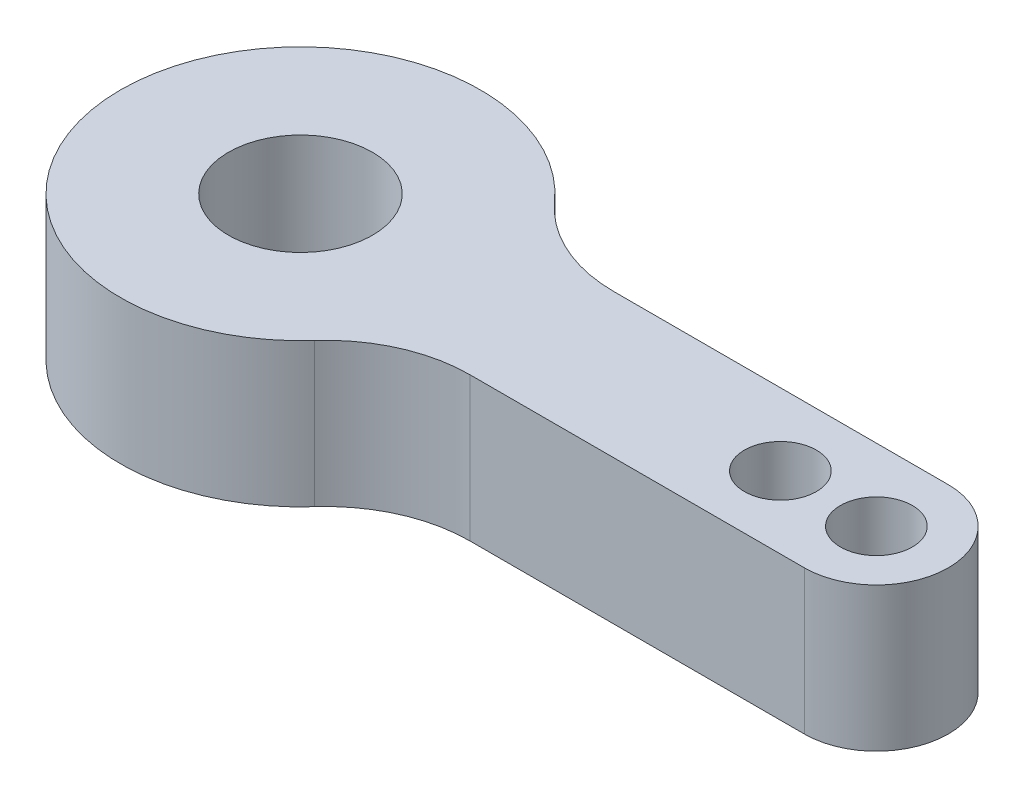
ISO-10303-21;
HEADER;
FILE_DESCRIPTION(('STEP AP214'),'2;1');
FILE_NAME('part.step','',(''),(''),'','','');
FILE_SCHEMA(('AUTOMOTIVE_DESIGN { 1 0 10303 214 1 1 1 1 }'));
ENDSEC;
DATA;
#1=APPLICATION_CONTEXT('core data for automotive mechanical design processes');
#2=APPLICATION_PROTOCOL_DEFINITION('international standard','automotive_design',2000,#1);
#3=PRODUCT_CONTEXT('',#1,'mechanical');
#4=PRODUCT('Part','Part','',(#3));
#5=PRODUCT_RELATED_PRODUCT_CATEGORY('part','',(#4));
#6=PRODUCT_DEFINITION_FORMATION('','',#4);
#7=PRODUCT_DEFINITION_CONTEXT('part definition',#1,'design');
#8=PRODUCT_DEFINITION('design','',#6,#7);
#9=PRODUCT_DEFINITION_SHAPE('','',#8);
#10=(LENGTH_UNIT() NAMED_UNIT(*) SI_UNIT(.MILLI.,.METRE.));
#11=(NAMED_UNIT(*) PLANE_ANGLE_UNIT() SI_UNIT($,.RADIAN.));
#12=(NAMED_UNIT(*) SI_UNIT($,.STERADIAN.) SOLID_ANGLE_UNIT());
#13=UNCERTAINTY_MEASURE_WITH_UNIT(LENGTH_MEASURE(1.E-05),#10,'distance_accuracy_value','');
#14=(GEOMETRIC_REPRESENTATION_CONTEXT(3) GLOBAL_UNCERTAINTY_ASSIGNED_CONTEXT((#13)) GLOBAL_UNIT_ASSIGNED_CONTEXT((#10,
#11,#12)) REPRESENTATION_CONTEXT('',''));
#15=CARTESIAN_POINT('',(0.,0.,0.));
#16=DIRECTION('',(0.,0.,1.));
#17=DIRECTION('',(1.,0.,0.));
#18=AXIS2_PLACEMENT_3D('',#15,#16,#17);
#19=CARTESIAN_POINT('',(0.,0.,0.));
#20=DIRECTION('',(0.,1.,0.));
#21=DIRECTION('',(0.,0.,1.));
#22=AXIS2_PLACEMENT_3D('',#19,#20,#21);
#23=PLANE('',#22);
#24=CARTESIAN_POINT('',(24.,0.,0.));
#25=DIRECTION('',(0.,-1.,0.));
#26=DIRECTION('',(0.,0.,-1.));
#27=AXIS2_PLACEMENT_3D('',#24,#25,#26);
#28=CIRCLE('',#27,1.5);
#29=CARTESIAN_POINT('',(24.,0.,-1.5));
#30=VERTEX_POINT('',#29);
#31=EDGE_CURVE('E108',#30,#30,#28,.F.);
#32=ORIENTED_EDGE('',*,*,#31,.T.);
#33=EDGE_LOOP('',(#32));
#34=FACE_BOUND('',#33,.T.);
#35=CARTESIAN_POINT('',(0.,0.,0.));
#36=DIRECTION('',(0.,-1.,0.));
#37=DIRECTION('',(0.,0.,-1.));
#38=AXIS2_PLACEMENT_3D('',#35,#36,#37);
#39=CIRCLE('',#38,3.);
#40=CARTESIAN_POINT('',(0.,0.,-3.));
#41=VERTEX_POINT('',#40);
#42=EDGE_CURVE('E111',#41,#41,#39,.F.);
#43=ORIENTED_EDGE('',*,*,#42,.T.);
#44=EDGE_LOOP('',(#43));
#45=FACE_BOUND('',#44,.T.);
#46=CARTESIAN_POINT('',(20.,0.,0.));
#47=DIRECTION('',(0.,-1.,0.));
#48=DIRECTION('',(0.,0.,-1.));
#49=AXIS2_PLACEMENT_3D('',#46,#47,#48);
#50=CIRCLE('',#49,1.5);
#51=CARTESIAN_POINT('',(20.,0.,-1.5));
#52=VERTEX_POINT('',#51);
#53=EDGE_CURVE('E114',#52,#52,#50,.F.);
#54=ORIENTED_EDGE('',*,*,#53,.T.);
#55=EDGE_LOOP('',(#54));
#56=FACE_BOUND('',#55,.T.);
#57=CARTESIAN_POINT('',(10.0623058987491,0.,9.00000000000001));
#58=DIRECTION('',(0.,-1.,0.));
#59=DIRECTION('',(0.,0.,-1.));
#60=AXIS2_PLACEMENT_3D('',#57,#58,#59);
#61=CIRCLE('',#60,6.);
#62=CARTESIAN_POINT('',(10.062305898749,0.,3.00000000000001));
#63=VERTEX_POINT('',#62);
#64=CARTESIAN_POINT('',(5.59016994374947,0.,5.00000000000001));
#65=VERTEX_POINT('',#64);
#66=EDGE_CURVE('E118',#63,#65,#61,.F.);
#67=ORIENTED_EDGE('',*,*,#66,.T.);
#68=CARTESIAN_POINT('',(0.,0.,0.));
#69=DIRECTION('',(0.,-1.,0.));
#70=DIRECTION('',(0.,0.,-1.));
#71=AXIS2_PLACEMENT_3D('',#68,#69,#70);
#72=CIRCLE('',#71,7.5);
#73=CARTESIAN_POINT('',(5.59016994374947,0.,-5.));
#74=VERTEX_POINT('',#73);
#75=EDGE_CURVE('E121',#74,#65,#72,.F.);
#76=ORIENTED_EDGE('',*,*,#75,.F.);
#77=CARTESIAN_POINT('',(10.0623058987491,0.,-9.));
#78=DIRECTION('',(0.,-1.,0.));
#79=DIRECTION('',(0.,0.,-1.));
#80=AXIS2_PLACEMENT_3D('',#77,#78,#79);
#81=CIRCLE('',#80,6.);
#82=CARTESIAN_POINT('',(10.0623058987491,0.,-3.));
#83=VERTEX_POINT('',#82);
#84=EDGE_CURVE('E80',#74,#83,#81,.F.);
#85=ORIENTED_EDGE('',*,*,#84,.T.);
#86=DIRECTION('',(1.,0.,0.));
#87=VECTOR('',#86,1.);
#88=CARTESIAN_POINT('',(0.,0.,-3.));
#89=LINE('',#88,#87);
#90=CARTESIAN_POINT('',(24.,0.,-3.));
#91=VERTEX_POINT('',#90);
#92=EDGE_CURVE('E78',#83,#91,#89,.T.);
#93=ORIENTED_EDGE('',*,*,#92,.T.);
#94=CARTESIAN_POINT('',(24.,0.,0.));
#95=DIRECTION('',(0.,-1.,0.));
#96=DIRECTION('',(0.,0.,-1.));
#97=AXIS2_PLACEMENT_3D('',#94,#95,#96);
#98=CIRCLE('',#97,3.);
#99=CARTESIAN_POINT('',(24.,0.,3.));
#100=VERTEX_POINT('',#99);
#101=EDGE_CURVE('E20',#100,#91,#98,.F.);
#102=ORIENTED_EDGE('',*,*,#101,.F.);
#103=DIRECTION('',(1.,0.,0.));
#104=VECTOR('',#103,1.);
#105=CARTESIAN_POINT('',(0.,0.,3.00000000000001));
#106=LINE('',#105,#104);
#107=EDGE_CURVE('E76',#63,#100,#106,.T.);
#108=ORIENTED_EDGE('',*,*,#107,.F.);
#109=EDGE_LOOP('',(#67,#76,#85,#93,#102,#108));
#110=FACE_BOUND('',#109,.T.);
#111=ADVANCED_FACE('F17',(#34,#45,#56,#110),#23,.F.);
#112=CARTESIAN_POINT('',(0.,6.,3.00000000000001));
#113=DIRECTION('',(0.,0.,1.));
#114=DIRECTION('',(1.,0.,0.));
#115=AXIS2_PLACEMENT_3D('',#112,#113,#114);
#116=PLANE('',#115);
#117=ORIENTED_EDGE('',*,*,#107,.T.);
#118=DIRECTION('',(0.,-1.,0.));
#119=VECTOR('',#118,1.);
#120=CARTESIAN_POINT('',(24.,6.,3.));
#121=LINE('',#120,#119);
#122=CARTESIAN_POINT('',(24.,6.,3.));
#123=VERTEX_POINT('',#122);
#124=EDGE_CURVE('E75',#123,#100,#121,.T.);
#125=ORIENTED_EDGE('',*,*,#124,.F.);
#126=DIRECTION('',(1.,0.,0.));
#127=VECTOR('',#126,1.);
#128=CARTESIAN_POINT('',(0.,6.,3.00000000000001));
#129=LINE('',#128,#127);
#130=CARTESIAN_POINT('',(10.0623058987491,6.,3.00000000000001));
#131=VERTEX_POINT('',#130);
#132=EDGE_CURVE('E107',#131,#123,#129,.T.);
#133=ORIENTED_EDGE('',*,*,#132,.F.);
#134=DIRECTION('',(0.,-1.,0.));
#135=VECTOR('',#134,1.);
#136=CARTESIAN_POINT('',(10.0623058987491,6.,3.00000000000001));
#137=LINE('',#136,#135);
#138=EDGE_CURVE('E120',#131,#63,#137,.T.);
#139=ORIENTED_EDGE('',*,*,#138,.T.);
#140=EDGE_LOOP('',(#117,#125,#133,#139));
#141=FACE_BOUND('',#140,.T.);
#142=ADVANCED_FACE('F138',(#141),#116,.T.);
#143=CARTESIAN_POINT('',(24.,6.,0.));
#144=DIRECTION('',(0.,-1.,0.));
#145=DIRECTION('',(0.,0.,-1.));
#146=AXIS2_PLACEMENT_3D('',#143,#144,#145);
#147=CYLINDRICAL_SURFACE('',#146,3.);
#148=CARTESIAN_POINT('',(24.,6.,0.));
#149=DIRECTION('',(0.,-1.,0.));
#150=DIRECTION('',(0.,0.,-1.));
#151=AXIS2_PLACEMENT_3D('',#148,#149,#150);
#152=CIRCLE('',#151,3.);
#153=CARTESIAN_POINT('',(24.,6.,-3.));
#154=VERTEX_POINT('',#153);
#155=EDGE_CURVE('E105',#123,#154,#152,.F.);
#156=ORIENTED_EDGE('',*,*,#155,.F.);
#157=ORIENTED_EDGE('',*,*,#124,.T.);
#158=ORIENTED_EDGE('',*,*,#101,.T.);
#159=DIRECTION('',(0.,1.,0.));
#160=VECTOR('',#159,1.);
#161=CARTESIAN_POINT('',(24.,6.,-3.));
#162=LINE('',#161,#160);
#163=EDGE_CURVE('E73',#91,#154,#162,.T.);
#164=ORIENTED_EDGE('',*,*,#163,.T.);
#165=EDGE_LOOP('',(#156,#157,#158,#164));
#166=FACE_BOUND('',#165,.T.);
#167=ADVANCED_FACE('F71',(#166),#147,.T.);
#168=CARTESIAN_POINT('',(0.,6.,-3.));
#169=DIRECTION('',(0.,0.,1.));
#170=DIRECTION('',(1.,0.,0.));
#171=AXIS2_PLACEMENT_3D('',#168,#169,#170);
#172=PLANE('',#171);
#173=DIRECTION('',(0.,-1.,0.));
#174=VECTOR('',#173,1.);
#175=CARTESIAN_POINT('',(10.0623058987491,6.,-3.));
#176=LINE('',#175,#174);
#177=CARTESIAN_POINT('',(10.0623058987491,6.,-3.));
#178=VERTEX_POINT('',#177);
#179=EDGE_CURVE('E91',#83,#178,#176,.F.);
#180=ORIENTED_EDGE('',*,*,#179,.T.);
#181=DIRECTION('',(1.,0.,0.));
#182=VECTOR('',#181,1.);
#183=CARTESIAN_POINT('',(0.,6.,-3.));
#184=LINE('',#183,#182);
#185=EDGE_CURVE('E86',#154,#178,#184,.F.);
#186=ORIENTED_EDGE('',*,*,#185,.F.);
#187=ORIENTED_EDGE('',*,*,#163,.F.);
#188=ORIENTED_EDGE('',*,*,#92,.F.);
#189=EDGE_LOOP('',(#180,#186,#187,#188));
#190=FACE_BOUND('',#189,.T.);
#191=ADVANCED_FACE('F84',(#190),#172,.F.);
#192=CARTESIAN_POINT('',(10.0623058987491,6.,-9.));
#193=DIRECTION('',(0.,-1.,0.));
#194=DIRECTION('',(0.,0.,-1.));
#195=AXIS2_PLACEMENT_3D('',#192,#193,#194);
#196=CYLINDRICAL_SURFACE('',#195,6.);
#197=ORIENTED_EDGE('',*,*,#179,.F.);
#198=ORIENTED_EDGE('',*,*,#84,.F.);
#199=DIRECTION('',(0.,-1.,0.));
#200=VECTOR('',#199,1.);
#201=CARTESIAN_POINT('',(5.59016994374947,6.,-5.));
#202=LINE('',#201,#200);
#203=CARTESIAN_POINT('',(5.59016994374947,6.,-5.));
#204=VERTEX_POINT('',#203);
#205=EDGE_CURVE('E123',#204,#74,#202,.T.);
#206=ORIENTED_EDGE('',*,*,#205,.F.);
#207=CARTESIAN_POINT('',(10.0623058987491,6.,-9.));
#208=DIRECTION('',(0.,-1.,0.));
#209=DIRECTION('',(0.,0.,-1.));
#210=AXIS2_PLACEMENT_3D('',#207,#208,#209);
#211=CIRCLE('',#210,6.);
#212=EDGE_CURVE('E103',#178,#204,#211,.T.);
#213=ORIENTED_EDGE('',*,*,#212,.F.);
#214=EDGE_LOOP('',(#197,#198,#206,#213));
#215=FACE_BOUND('',#214,.T.);
#216=ADVANCED_FACE('F145',(#215),#196,.F.);
#217=CARTESIAN_POINT('',(0.,6.,0.));
#218=DIRECTION('',(0.,-1.,0.));
#219=DIRECTION('',(0.,0.,-1.));
#220=AXIS2_PLACEMENT_3D('',#217,#218,#219);
#221=CYLINDRICAL_SURFACE('',#220,7.5);
#222=ORIENTED_EDGE('',*,*,#75,.T.);
#223=DIRECTION('',(0.,-1.,0.));
#224=VECTOR('',#223,1.);
#225=CARTESIAN_POINT('',(5.59016994374947,6.,5.00000000000001));
#226=LINE('',#225,#224);
#227=CARTESIAN_POINT('',(5.59016994374947,6.,5.00000000000001));
#228=VERTEX_POINT('',#227);
#229=EDGE_CURVE('E117',#65,#228,#226,.F.);
#230=ORIENTED_EDGE('',*,*,#229,.T.);
#231=CARTESIAN_POINT('',(0.,6.,0.));
#232=DIRECTION('',(0.,-1.,0.));
#233=DIRECTION('',(0.,0.,-1.));
#234=AXIS2_PLACEMENT_3D('',#231,#232,#233);
#235=CIRCLE('',#234,7.5);
#236=EDGE_CURVE('E35',#204,#228,#235,.F.);
#237=ORIENTED_EDGE('',*,*,#236,.F.);
#238=ORIENTED_EDGE('',*,*,#205,.T.);
#239=EDGE_LOOP('',(#222,#230,#237,#238));
#240=FACE_BOUND('',#239,.T.);
#241=ADVANCED_FACE('F143',(#240),#221,.T.);
#242=CARTESIAN_POINT('',(10.0623058987491,6.,9.00000000000001));
#243=DIRECTION('',(0.,-1.,0.));
#244=DIRECTION('',(0.,0.,-1.));
#245=AXIS2_PLACEMENT_3D('',#242,#243,#244);
#246=CYLINDRICAL_SURFACE('',#245,6.);
#247=ORIENTED_EDGE('',*,*,#229,.F.);
#248=ORIENTED_EDGE('',*,*,#66,.F.);
#249=ORIENTED_EDGE('',*,*,#138,.F.);
#250=CARTESIAN_POINT('',(10.0623058987491,6.,9.00000000000001));
#251=DIRECTION('',(0.,-1.,0.));
#252=DIRECTION('',(0.,0.,-1.));
#253=AXIS2_PLACEMENT_3D('',#250,#251,#252);
#254=CIRCLE('',#253,6.);
#255=EDGE_CURVE('E100',#228,#131,#254,.T.);
#256=ORIENTED_EDGE('',*,*,#255,.F.);
#257=EDGE_LOOP('',(#247,#248,#249,#256));
#258=FACE_BOUND('',#257,.T.);
#259=ADVANCED_FACE('F142',(#258),#246,.F.);
#260=CARTESIAN_POINT('',(20.,6.,0.));
#261=DIRECTION('',(0.,-1.,0.));
#262=DIRECTION('',(0.,0.,-1.));
#263=AXIS2_PLACEMENT_3D('',#260,#261,#262);
#264=CYLINDRICAL_SURFACE('',#263,1.5);
#265=CARTESIAN_POINT('',(20.,6.,0.));
#266=DIRECTION('',(0.,-1.,0.));
#267=DIRECTION('',(0.,0.,-1.));
#268=AXIS2_PLACEMENT_3D('',#265,#266,#267);
#269=CIRCLE('',#268,1.5);
#270=CARTESIAN_POINT('',(20.,6.,-1.5));
#271=VERTEX_POINT('',#270);
#272=EDGE_CURVE('E97',#271,#271,#269,.T.);
#273=ORIENTED_EDGE('',*,*,#272,.F.);
#274=EDGE_LOOP('',(#273));
#275=FACE_BOUND('',#274,.T.);
#276=ORIENTED_EDGE('',*,*,#53,.F.);
#277=EDGE_LOOP('',(#276));
#278=FACE_BOUND('',#277,.T.);
#279=ADVANCED_FACE('F152',(#275,#278),#264,.F.);
#280=CARTESIAN_POINT('',(0.,6.,0.));
#281=DIRECTION('',(0.,-1.,0.));
#282=DIRECTION('',(0.,0.,-1.));
#283=AXIS2_PLACEMENT_3D('',#280,#281,#282);
#284=CYLINDRICAL_SURFACE('',#283,3.);
#285=CARTESIAN_POINT('',(0.,6.,0.));
#286=DIRECTION('',(0.,-1.,0.));
#287=DIRECTION('',(0.,0.,-1.));
#288=AXIS2_PLACEMENT_3D('',#285,#286,#287);
#289=CIRCLE('',#288,3.);
#290=CARTESIAN_POINT('',(0.,6.,-3.));
#291=VERTEX_POINT('',#290);
#292=EDGE_CURVE('E26',#291,#291,#289,.T.);
#293=ORIENTED_EDGE('',*,*,#292,.F.);
#294=EDGE_LOOP('',(#293));
#295=FACE_BOUND('',#294,.T.);
#296=ORIENTED_EDGE('',*,*,#42,.F.);
#297=EDGE_LOOP('',(#296));
#298=FACE_BOUND('',#297,.T.);
#299=ADVANCED_FACE('F163',(#295,#298),#284,.F.);
#300=CARTESIAN_POINT('',(24.,6.,0.));
#301=DIRECTION('',(0.,-1.,0.));
#302=DIRECTION('',(0.,0.,-1.));
#303=AXIS2_PLACEMENT_3D('',#300,#301,#302);
#304=CYLINDRICAL_SURFACE('',#303,1.5);
#305=CARTESIAN_POINT('',(24.,6.,0.));
#306=DIRECTION('',(0.,-1.,0.));
#307=DIRECTION('',(0.,0.,-1.));
#308=AXIS2_PLACEMENT_3D('',#305,#306,#307);
#309=CIRCLE('',#308,1.5);
#310=CARTESIAN_POINT('',(24.,6.,-1.5));
#311=VERTEX_POINT('',#310);
#312=EDGE_CURVE('E11',#311,#311,#309,.T.);
#313=ORIENTED_EDGE('',*,*,#312,.F.);
#314=EDGE_LOOP('',(#313));
#315=FACE_BOUND('',#314,.T.);
#316=ORIENTED_EDGE('',*,*,#31,.F.);
#317=EDGE_LOOP('',(#316));
#318=FACE_BOUND('',#317,.T.);
#319=ADVANCED_FACE('F157',(#315,#318),#304,.F.);
#320=CARTESIAN_POINT('',(0.,6.,0.));
#321=DIRECTION('',(0.,1.,0.));
#322=DIRECTION('',(0.,0.,1.));
#323=AXIS2_PLACEMENT_3D('',#320,#321,#322);
#324=PLANE('',#323);
#325=ORIENTED_EDGE('',*,*,#312,.T.);
#326=EDGE_LOOP('',(#325));
#327=FACE_BOUND('',#326,.T.);
#328=ORIENTED_EDGE('',*,*,#292,.T.);
#329=EDGE_LOOP('',(#328));
#330=FACE_BOUND('',#329,.T.);
#331=ORIENTED_EDGE('',*,*,#272,.T.);
#332=EDGE_LOOP('',(#331));
#333=FACE_BOUND('',#332,.T.);
#334=ORIENTED_EDGE('',*,*,#236,.T.);
#335=ORIENTED_EDGE('',*,*,#255,.T.);
#336=ORIENTED_EDGE('',*,*,#132,.T.);
#337=ORIENTED_EDGE('',*,*,#155,.T.);
#338=ORIENTED_EDGE('',*,*,#185,.T.);
#339=ORIENTED_EDGE('',*,*,#212,.T.);
#340=EDGE_LOOP('',(#334,#335,#336,#337,#338,#339));
#341=FACE_BOUND('',#340,.T.);
#342=ADVANCED_FACE('F133',(#327,#330,#333,#341),#324,.T.);
#343=CLOSED_SHELL('',(#111,#142,#167,#191,#216,#241,#259,#279,#299,#319,#342));
#344=MANIFOLD_SOLID_BREP('B1',#343);
#345=ADVANCED_BREP_SHAPE_REPRESENTATION('',(#18,#344),#14);
#346=SHAPE_DEFINITION_REPRESENTATION(#9,#345);
ENDSEC;
END-ISO-10303-21;
